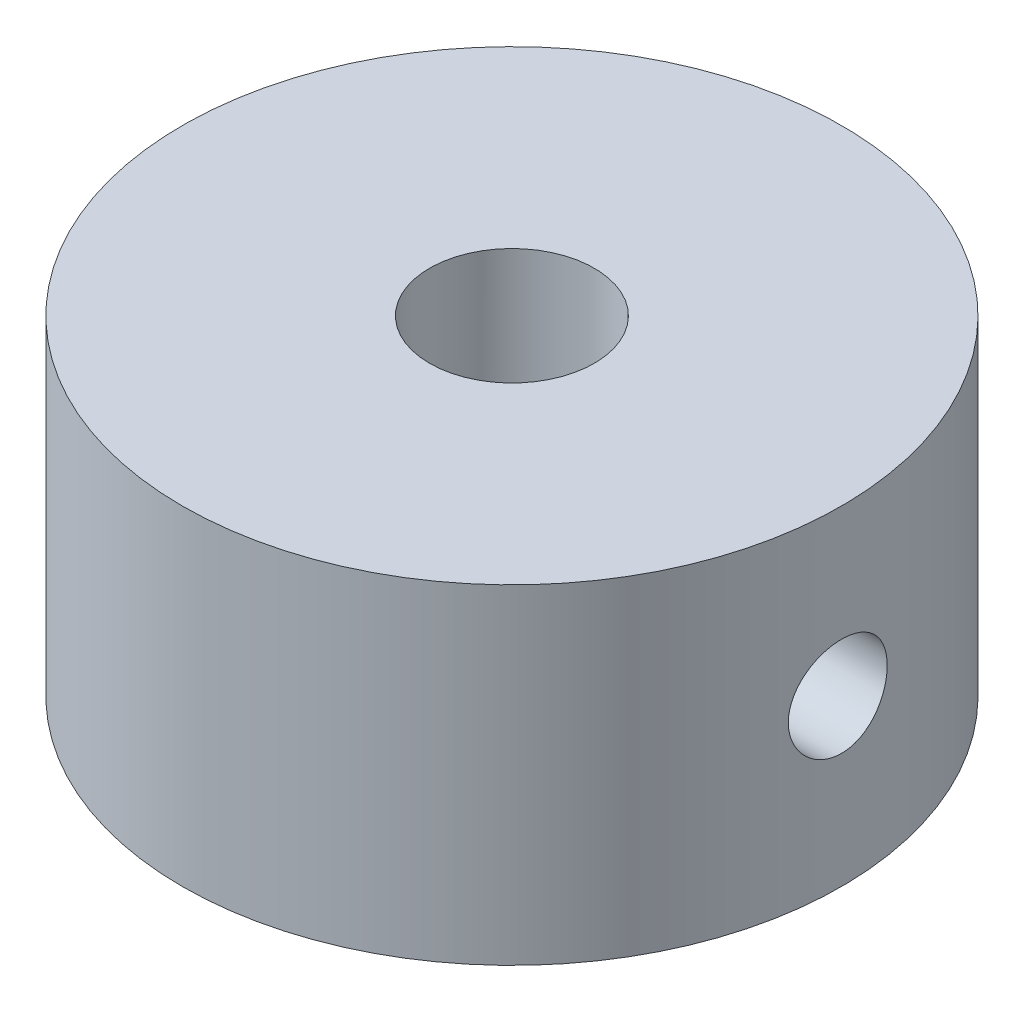
ISO-10303-21;
HEADER;
FILE_DESCRIPTION(('STEP AP214'),'2;1');
FILE_NAME('part.step','',(''),(''),'','','');
FILE_SCHEMA(('AUTOMOTIVE_DESIGN { 1 0 10303 214 1 1 1 1 }'));
ENDSEC;
DATA;
#1=APPLICATION_CONTEXT('core data for automotive mechanical design processes');
#2=APPLICATION_PROTOCOL_DEFINITION('international standard','automotive_design',2000,#1);
#3=PRODUCT_CONTEXT('',#1,'mechanical');
#4=PRODUCT('Part','Part','',(#3));
#5=PRODUCT_RELATED_PRODUCT_CATEGORY('part','',(#4));
#6=PRODUCT_DEFINITION_FORMATION('','',#4);
#7=PRODUCT_DEFINITION_CONTEXT('part definition',#1,'design');
#8=PRODUCT_DEFINITION('design','',#6,#7);
#9=PRODUCT_DEFINITION_SHAPE('','',#8);
#10=(LENGTH_UNIT() NAMED_UNIT(*) SI_UNIT(.MILLI.,.METRE.));
#11=(NAMED_UNIT(*) PLANE_ANGLE_UNIT() SI_UNIT($,.RADIAN.));
#12=(NAMED_UNIT(*) SI_UNIT($,.STERADIAN.) SOLID_ANGLE_UNIT());
#13=UNCERTAINTY_MEASURE_WITH_UNIT(LENGTH_MEASURE(1.E-05),#10,'distance_accuracy_value','');
#14=(GEOMETRIC_REPRESENTATION_CONTEXT(3) GLOBAL_UNCERTAINTY_ASSIGNED_CONTEXT((#13)) GLOBAL_UNIT_ASSIGNED_CONTEXT((#10,
#11,#12)) REPRESENTATION_CONTEXT('',''));
#15=CARTESIAN_POINT('',(0.,0.,0.));
#16=DIRECTION('',(0.,0.,1.));
#17=DIRECTION('',(1.,0.,0.));
#18=AXIS2_PLACEMENT_3D('',#15,#16,#17);
#19=CARTESIAN_POINT('',(0.,10.,0.));
#20=DIRECTION('',(0.,1.,0.));
#21=DIRECTION('',(0.,0.,1.));
#22=AXIS2_PLACEMENT_3D('',#19,#20,#21);
#23=PLANE('',#22);
#24=CARTESIAN_POINT('',(0.,10.,0.));
#25=DIRECTION('',(0.,1.,0.));
#26=DIRECTION('',(0.,0.,1.));
#27=AXIS2_PLACEMENT_3D('',#24,#25,#26);
#28=CIRCLE('',#27,10.);
#29=CARTESIAN_POINT('',(0.,10.,10.));
#30=VERTEX_POINT('',#29);
#31=EDGE_CURVE('E10',#30,#30,#28,.T.);
#32=ORIENTED_EDGE('',*,*,#31,.T.);
#33=EDGE_LOOP('',(#32));
#34=FACE_BOUND('',#33,.T.);
#35=CARTESIAN_POINT('',(0.,10.,0.));
#36=DIRECTION('',(0.,1.,0.));
#37=DIRECTION('',(0.,0.,1.));
#38=AXIS2_PLACEMENT_3D('',#35,#36,#37);
#39=CIRCLE('',#38,2.5);
#40=CARTESIAN_POINT('',(0.,10.,2.5));
#41=VERTEX_POINT('',#40);
#42=EDGE_CURVE('E49',#41,#41,#39,.T.);
#43=ORIENTED_EDGE('',*,*,#42,.F.);
#44=EDGE_LOOP('',(#43));
#45=FACE_BOUND('',#44,.T.);
#46=ADVANCED_FACE('F31',(#34,#45),#23,.T.);
#47=CARTESIAN_POINT('',(0.,0.,0.));
#48=DIRECTION('',(0.,1.,0.));
#49=DIRECTION('',(0.,0.,1.));
#50=AXIS2_PLACEMENT_3D('',#47,#48,#49);
#51=PLANE('',#50);
#52=CARTESIAN_POINT('',(0.,0.,0.));
#53=DIRECTION('',(0.,1.,0.));
#54=DIRECTION('',(0.,0.,1.));
#55=AXIS2_PLACEMENT_3D('',#52,#53,#54);
#56=CIRCLE('',#55,10.);
#57=CARTESIAN_POINT('',(0.,0.,10.));
#58=VERTEX_POINT('',#57);
#59=EDGE_CURVE('E44',#58,#58,#56,.T.);
#60=ORIENTED_EDGE('',*,*,#59,.F.);
#61=EDGE_LOOP('',(#60));
#62=FACE_BOUND('',#61,.T.);
#63=CARTESIAN_POINT('',(0.,0.,0.));
#64=DIRECTION('',(0.,1.,0.));
#65=DIRECTION('',(0.,0.,1.));
#66=AXIS2_PLACEMENT_3D('',#63,#64,#65);
#67=CIRCLE('',#66,2.5);
#68=CARTESIAN_POINT('',(0.,0.,2.5));
#69=VERTEX_POINT('',#68);
#70=EDGE_CURVE('E52',#69,#69,#67,.T.);
#71=ORIENTED_EDGE('',*,*,#70,.T.);
#72=EDGE_LOOP('',(#71));
#73=FACE_BOUND('',#72,.T.);
#74=ADVANCED_FACE('F85',(#62,#73),#51,.F.);
#75=CARTESIAN_POINT('',(0.,10.,0.));
#76=DIRECTION('',(0.,-1.,0.));
#77=DIRECTION('',(0.,0.,-1.));
#78=AXIS2_PLACEMENT_3D('',#75,#76,#77);
#79=CYLINDRICAL_SURFACE('',#78,10.);
#80=CARTESIAN_POINT('',(-9.88685996664259,5.,-1.5));
#81=CARTESIAN_POINT('',(-9.88686136668593,5.08374556928995,-1.49999654107284));
#82=CARTESIAN_POINT('',(-9.88793551739101,5.16753975075071,-1.49296296388491));
#83=CARTESIAN_POINT('',(-9.8921131480324,5.33278531488313,-1.46502196657001));
#84=CARTESIAN_POINT('',(-9.8952186073143,5.41423433148001,-1.44410101402628));
#85=CARTESIAN_POINT('',(-9.90309938986228,5.5723737554469,-1.38902526098084));
#86=CARTESIAN_POINT('',(-9.90787343131536,5.64906776254216,-1.35488061681397));
#87=CARTESIAN_POINT('',(-9.91855194113145,5.79562703077208,-1.27435063087791));
#88=CARTESIAN_POINT('',(-9.92445625383668,5.8654932302143,-1.22796697429872));
#89=CARTESIAN_POINT('',(-9.9367828924804,5.99698381675433,-1.12387902418558));
#90=CARTESIAN_POINT('',(-9.94320862458057,6.05854561340674,-1.0660960558482));
#91=CARTESIAN_POINT('',(-9.95582368169047,6.1711374856555,-0.941019605444373));
#92=CARTESIAN_POINT('',(-9.96201299368615,6.22216698216699,-0.873725600786529));
#93=CARTESIAN_POINT('',(-9.97349347428185,6.31247663169136,-0.731136358052745));
#94=CARTESIAN_POINT('',(-9.97878018435569,6.35169915032246,-0.655804227365766));
#95=CARTESIAN_POINT('',(-9.98782206746405,6.41691159880818,-0.499528850106974));
#96=CARTESIAN_POINT('',(-9.99157732141945,6.44290222784289,-0.418585900270677));
#97=CARTESIAN_POINT('',(-9.99710914797782,6.48072338853084,-0.254031123090569));
#98=CARTESIAN_POINT('',(-9.99890035887344,6.49265872638717,-0.170443884389866));
#99=CARTESIAN_POINT('',(-10.0003524476958,6.5023559348249,-0.0024352040194791));
#100=CARTESIAN_POINT('',(-10.0000134440494,6.50011859331969,0.0819861910157462));
#101=CARTESIAN_POINT('',(-9.99725499660796,6.48161666223757,0.24855171820052));
#102=CARTESIAN_POINT('',(-9.99485227652479,6.46546482820852,0.330708691400007));
#103=CARTESIAN_POINT('',(-9.98825500227851,6.41976939367743,0.491132829143137));
#104=CARTESIAN_POINT('',(-9.98406040199739,6.39022544849856,0.569399893513481));
#105=CARTESIAN_POINT('',(-9.97432193873206,6.31846900308291,0.720163780770317));
#106=CARTESIAN_POINT('',(-9.96877303515638,6.27620903489126,0.792637672323596));
#107=CARTESIAN_POINT('',(-9.95694438245421,6.18025480633001,0.929507907150177));
#108=CARTESIAN_POINT('',(-9.95066458523184,6.12655979329314,0.993903718271735));
#109=CARTESIAN_POINT('',(-9.93800158192627,6.00863155117341,1.11345448272265));
#110=CARTESIAN_POINT('',(-9.93161796623257,5.94429987802989,1.16851232950947));
#111=CARTESIAN_POINT('',(-9.91952704453523,5.80725892287627,1.26706599338813));
#112=CARTESIAN_POINT('',(-9.91381974269649,5.73454958928008,1.31056173927999));
#113=CARTESIAN_POINT('',(-9.90372775286855,5.58271603705936,1.38476964534605));
#114=CARTESIAN_POINT('',(-9.89934409845291,5.50358686633761,1.41547182270082));
#115=CARTESIAN_POINT('',(-9.89241402899059,5.34121474485261,1.46312336208879));
#116=CARTESIAN_POINT('',(-9.88986748446299,5.25797208445325,1.48007369337326));
#117=CARTESIAN_POINT('',(-9.88692451395027,5.09059991042251,1.49960720086655));
#118=CARTESIAN_POINT('',(-9.88650748802574,5.00648681179847,1.50232803265052));
#119=CARTESIAN_POINT('',(-9.88781607937153,4.83900580518266,1.49369057019819));
#120=CARTESIAN_POINT('',(-9.88954163015778,4.75563787414923,1.48233271282302));
#121=CARTESIAN_POINT('',(-9.89492202461453,4.59244018203437,1.44597702952766));
#122=CARTESIAN_POINT('',(-9.89856716482858,4.5125947950584,1.42104778527821));
#123=CARTESIAN_POINT('',(-9.90736801825768,4.35821590795139,1.35832831947087));
#124=CARTESIAN_POINT('',(-9.91252380607176,4.2836826703718,1.32053746276389));
#125=CARTESIAN_POINT('',(-9.92381355687063,4.14142673966496,1.23283677995324));
#126=CARTESIAN_POINT('',(-9.92995459279988,4.07375955272018,1.18283784561766));
#127=CARTESIAN_POINT('',(-9.94250159433355,3.94772714012619,1.07226416837201));
#128=CARTESIAN_POINT('',(-9.94890757490292,3.88936244081885,1.0116888274468));
#129=CARTESIAN_POINT('',(-9.96132705217386,3.78309739336642,0.881075619628184));
#130=CARTESIAN_POINT('',(-9.96733683460423,3.73528827175752,0.810963126771958));
#131=CARTESIAN_POINT('',(-9.97822905032016,3.65212709473736,0.663622080263682));
#132=CARTESIAN_POINT('',(-9.98311151444563,3.61677469853497,0.586393721360439));
#133=CARTESIAN_POINT('',(-9.99118269660795,3.55967625751197,0.427297995861147));
#134=CARTESIAN_POINT('',(-9.99437761717899,3.53788033292164,0.345448858754303));
#135=CARTESIAN_POINT('',(-9.99873976656896,3.50835212046253,0.179200815501194));
#136=CARTESIAN_POINT('',(-9.99990712930801,3.50061890375086,0.0948020781305815));
#137=CARTESIAN_POINT('',(-10.0000812905914,3.4994582954506,-0.073264590860818));
#138=CARTESIAN_POINT('',(-9.99910917023796,3.50589131912302,-0.156931570212052));
#139=CARTESIAN_POINT('',(-9.99515610519141,3.53258138842076,-0.321979795323107));
#140=CARTESIAN_POINT('',(-9.99217516692666,3.55283838980856,-0.403361048396512));
#141=CARTESIAN_POINT('',(-9.98453786742463,3.60655187557024,-0.561489374379661));
#142=CARTESIAN_POINT('',(-9.97988273316947,3.63999869513893,-0.638239793148783));
#143=CARTESIAN_POINT('',(-9.96940834495499,3.71912748798314,-0.785061117896603));
#144=CARTESIAN_POINT('',(-9.96358905320338,3.76480985848034,-0.855131806920709));
#145=CARTESIAN_POINT('',(-9.95136510636178,3.86761769882917,-0.987312585191959));
#146=CARTESIAN_POINT('',(-9.94495548425942,3.92484622581634,-1.04934206644638));
#147=CARTESIAN_POINT('',(-9.93231001689001,4.04890507308047,-1.16296808390268));
#148=CARTESIAN_POINT('',(-9.92607421276291,4.11573764382435,-1.21456216798984));
#149=CARTESIAN_POINT('',(-9.91444484029116,4.25754898323253,-1.30611310822974));
#150=CARTESIAN_POINT('',(-9.90905620156985,4.33257141702183,-1.34600294291209));
#151=CARTESIAN_POINT('',(-9.89978909110724,4.4882967767633,-1.41255613872045));
#152=CARTESIAN_POINT('',(-9.89590905307931,4.56899370785782,-1.43923322574898));
#153=CARTESIAN_POINT('',(-9.89099485524825,4.70837743625648,-1.47254951890026));
#154=CARTESIAN_POINT('',(-9.88945249382379,4.76620339692427,-1.4828276978042));
#155=CARTESIAN_POINT('',(-9.88738456567011,4.88267829173435,-1.49655410576574));
#156=CARTESIAN_POINT('',(-9.88685898576155,4.94132721519961,-1.50000242335076));
#157=CARTESIAN_POINT('',(-9.88685996664259,5.,-1.5));
#158=B_SPLINE_CURVE_WITH_KNOTS('',3,(#80,#81,#82,#83,#84,#85,#86,#87,#88,#89,#90,#91,#92,#93,
#94,#95,#96,#97,#98,#99,#100,#101,#102,#103,#104,#105,#106,#107,#108,#109,#110,#111,#112,#113,
#114,#115,#116,#117,#118,#119,#120,#121,#122,#123,#124,#125,#126,#127,#128,#129,#130,#131,#132,
#133,#134,#135,#136,#137,#138,#139,#140,#141,#142,#143,#144,#145,#146,#147,#148,#149,#150,#151,
#152,#153,#154,#155,#156,#157),.UNSPECIFIED.,.T.,.F.,(4,2,2,2,2,2,2,2,2,2,2,2,2,2,2,2,2,2,2,2,2,
2,2,2,2,2,2,2,2,2,2,2,2,2,2,2,2,2,4),(0.,0.251022251804869,0.502289469561802,0.753364085335675,
1.00440414866133,1.25724158649108,1.51009292207817,1.76415922105782,2.01821209364501,
2.27035832534397,2.52249053939374,2.77259862515728,3.02271314839401,3.27377316386454,
3.52484970949272,3.77839544666269,4.0319427451435,4.28568751773139,4.53941440444341,
4.79068214603744,5.04194209099918,5.29194394807374,5.54195815286117,5.79385486001302,
6.04576581461802,6.29977537753516,6.55377799071854,6.8068404089109,7.05988611170473,
7.31044963622327,7.56101235892823,7.81139182257833,8.06177941567107,8.31450950010969,
8.56729890236862,8.82150878824931,9.07545403445564,9.25132441891613,9.42719252376192),.UNSPECIFIED.);
#159=CARTESIAN_POINT('',(-9.88685996664259,5.,-1.5));
#160=VERTEX_POINT('',#159);
#161=EDGE_CURVE('E75',#160,#160,#158,.T.);
#162=ORIENTED_EDGE('',*,*,#161,.T.);
#163=EDGE_LOOP('',(#162));
#164=FACE_BOUND('',#163,.T.);
#165=CARTESIAN_POINT('',(9.88685996664259,5.,-1.5));
#166=CARTESIAN_POINT('',(9.88686136668593,4.91625443071005,-1.49999654107284));
#167=CARTESIAN_POINT('',(9.88793551739101,4.83246024924929,-1.49296296388491));
#168=CARTESIAN_POINT('',(9.8921131480324,4.66721468511687,-1.46502196657001));
#169=CARTESIAN_POINT('',(9.8952186073143,4.58576566851999,-1.44410101402628));
#170=CARTESIAN_POINT('',(9.90309938986228,4.4276262445531,-1.38902526098084));
#171=CARTESIAN_POINT('',(9.90787343131536,4.35093223745784,-1.35488061681397));
#172=CARTESIAN_POINT('',(9.91855194113145,4.20437296922792,-1.27435063087791));
#173=CARTESIAN_POINT('',(9.92445625383668,4.1345067697857,-1.22796697429872));
#174=CARTESIAN_POINT('',(9.9367828924804,4.00301618324567,-1.12387902418558));
#175=CARTESIAN_POINT('',(9.94320862458057,3.94145438659326,-1.0660960558482));
#176=CARTESIAN_POINT('',(9.95582368169047,3.8288625143445,-0.941019605444373));
#177=CARTESIAN_POINT('',(9.96201299368615,3.77783301783301,-0.873725600786529));
#178=CARTESIAN_POINT('',(9.97349347428185,3.68752336830864,-0.731136358052745));
#179=CARTESIAN_POINT('',(9.97878018435569,3.64830084967754,-0.655804227365766));
#180=CARTESIAN_POINT('',(9.98782206746405,3.58308840119182,-0.499528850106974));
#181=CARTESIAN_POINT('',(9.99157732141945,3.55709777215711,-0.418585900270677));
#182=CARTESIAN_POINT('',(9.99710914797782,3.51927661146916,-0.254031123090569));
#183=CARTESIAN_POINT('',(9.99890035887344,3.50734127361284,-0.170443884389866));
#184=CARTESIAN_POINT('',(10.0003524476958,3.4976440651751,-0.00243520401947892));
#185=CARTESIAN_POINT('',(10.0000134440494,3.49988140668031,0.0819861910157463));
#186=CARTESIAN_POINT('',(9.99725499660796,3.51838333776243,0.24855171820052));
#187=CARTESIAN_POINT('',(9.99485227652479,3.53453517179148,0.330708691400008));
#188=CARTESIAN_POINT('',(9.98825500227851,3.58023060632258,0.491132829143137));
#189=CARTESIAN_POINT('',(9.98406040199739,3.60977455150144,0.569399893513482));
#190=CARTESIAN_POINT('',(9.97432193873206,3.68153099691709,0.720163780770317));
#191=CARTESIAN_POINT('',(9.96877303515638,3.72379096510874,0.792637672323596));
#192=CARTESIAN_POINT('',(9.95694438245421,3.81974519366999,0.929507907150178));
#193=CARTESIAN_POINT('',(9.95066458523184,3.87344020670687,0.993903718271736));
#194=CARTESIAN_POINT('',(9.93800158192627,3.99136844882659,1.11345448272265));
#195=CARTESIAN_POINT('',(9.93161796623257,4.05570012197011,1.16851232950947));
#196=CARTESIAN_POINT('',(9.91952704453523,4.19274107712373,1.26706599338813));
#197=CARTESIAN_POINT('',(9.91381974269649,4.26545041071992,1.31056173927999));
#198=CARTESIAN_POINT('',(9.90372775286855,4.41728396294064,1.38476964534605));
#199=CARTESIAN_POINT('',(9.89934409845291,4.49641313366239,1.41547182270082));
#200=CARTESIAN_POINT('',(9.89241402899059,4.65878525514739,1.46312336208879));
#201=CARTESIAN_POINT('',(9.88986748446299,4.74202791554675,1.48007369337326));
#202=CARTESIAN_POINT('',(9.88692451395027,4.90940008957749,1.49960720086655));
#203=CARTESIAN_POINT('',(9.88650748802574,4.99351318820153,1.50232803265052));
#204=CARTESIAN_POINT('',(9.88781607937153,5.16099419481734,1.49369057019819));
#205=CARTESIAN_POINT('',(9.88954163015778,5.24436212585076,1.48233271282302));
#206=CARTESIAN_POINT('',(9.89492202461453,5.40755981796563,1.44597702952766));
#207=CARTESIAN_POINT('',(9.89856716482858,5.4874052049416,1.42104778527821));
#208=CARTESIAN_POINT('',(9.90736801825768,5.64178409204861,1.35832831947087));
#209=CARTESIAN_POINT('',(9.91252380607176,5.7163173296282,1.32053746276389));
#210=CARTESIAN_POINT('',(9.92381355687063,5.85857326033504,1.23283677995324));
#211=CARTESIAN_POINT('',(9.92995459279988,5.92624044727982,1.18283784561766));
#212=CARTESIAN_POINT('',(9.94250159433355,6.05227285987381,1.07226416837201));
#213=CARTESIAN_POINT('',(9.94890757490292,6.11063755918115,1.0116888274468));
#214=CARTESIAN_POINT('',(9.96132705217386,6.21690260663358,0.881075619628183));
#215=CARTESIAN_POINT('',(9.96733683460423,6.26471172824248,0.810963126771957));
#216=CARTESIAN_POINT('',(9.97822905032016,6.34787290526264,0.663622080263681));
#217=CARTESIAN_POINT('',(9.98311151444563,6.38322530146503,0.586393721360439));
#218=CARTESIAN_POINT('',(9.99118269660795,6.44032374248803,0.427297995861147));
#219=CARTESIAN_POINT('',(9.99437761717899,6.46211966707836,0.345448858754303));
#220=CARTESIAN_POINT('',(9.99873976656896,6.49164787953747,0.179200815501194));
#221=CARTESIAN_POINT('',(9.99990712930801,6.49938109624914,0.0948020781305813));
#222=CARTESIAN_POINT('',(10.0000812905914,6.5005417045494,-0.0732645908608179));
#223=CARTESIAN_POINT('',(9.99910917023796,6.49410868087698,-0.156931570212051));
#224=CARTESIAN_POINT('',(9.99515610519141,6.46741861157924,-0.321979795323106));
#225=CARTESIAN_POINT('',(9.99217516692666,6.44716161019144,-0.403361048396512));
#226=CARTESIAN_POINT('',(9.98453786742463,6.39344812442976,-0.56148937437966));
#227=CARTESIAN_POINT('',(9.97988273316947,6.36000130486107,-0.638239793148782));
#228=CARTESIAN_POINT('',(9.96940834495499,6.28087251201686,-0.785061117896602));
#229=CARTESIAN_POINT('',(9.96358905320338,6.23519014151966,-0.855131806920708));
#230=CARTESIAN_POINT('',(9.95136510636178,6.13238230117083,-0.987312585191958));
#231=CARTESIAN_POINT('',(9.94495548425942,6.07515377418366,-1.04934206644638));
#232=CARTESIAN_POINT('',(9.93231001689001,5.95109492691953,-1.16296808390268));
#233=CARTESIAN_POINT('',(9.92607421276291,5.88426235617565,-1.21456216798984));
#234=CARTESIAN_POINT('',(9.91444484029116,5.74245101676747,-1.30611310822974));
#235=CARTESIAN_POINT('',(9.90905620156985,5.66742858297817,-1.34600294291209));
#236=CARTESIAN_POINT('',(9.89978909110724,5.5117032232367,-1.41255613872045));
#237=CARTESIAN_POINT('',(9.89590905307931,5.43100629214218,-1.43923322574897));
#238=CARTESIAN_POINT('',(9.89099485524825,5.29162256374353,-1.47254951890026));
#239=CARTESIAN_POINT('',(9.88945249382379,5.23379660307573,-1.4828276978042));
#240=CARTESIAN_POINT('',(9.88738456567011,5.11732170826565,-1.49655410576574));
#241=CARTESIAN_POINT('',(9.88685898576155,5.05867278480039,-1.50000242335076));
#242=CARTESIAN_POINT('',(9.88685996664259,5.,-1.5));
#243=B_SPLINE_CURVE_WITH_KNOTS('',3,(#165,#166,#167,#168,#169,#170,#171,#172,#173,#174,#175,
#176,#177,#178,#179,#180,#181,#182,#183,#184,#185,#186,#187,#188,#189,#190,#191,#192,#193,#194,
#195,#196,#197,#198,#199,#200,#201,#202,#203,#204,#205,#206,#207,#208,#209,#210,#211,#212,#213,
#214,#215,#216,#217,#218,#219,#220,#221,#222,#223,#224,#225,#226,#227,#228,#229,#230,#231,#232,
#233,#234,#235,#236,#237,#238,#239,#240,#241,#242),.UNSPECIFIED.,.T.,.F.,(4,2,2,2,2,2,2,2,2,2,2,
2,2,2,2,2,2,2,2,2,2,2,2,2,2,2,2,2,2,2,2,2,2,2,2,2,2,2,4),(0.,0.251022251804869,
0.502289469561802,0.753364085335675,1.00440414866133,1.25724158649108,1.51009292207817,
1.76415922105782,2.01821209364501,2.27035832534397,2.52249053939374,2.77259862515728,
3.02271314839401,3.27377316386454,3.52484970949272,3.77839544666269,4.0319427451435,
4.28568751773139,4.53941440444341,4.79068214603744,5.04194209099918,5.29194394807374,
5.54195815286117,5.79385486001302,6.04576581461802,6.29977537753516,6.55377799071854,
6.8068404089109,7.05988611170473,7.31044963622326,7.56101235892823,7.81139182257833,
8.06177941567106,8.31450950010969,8.56729890236862,8.82150878824931,9.07545403445563,
9.25132441891613,9.42719252376192),.UNSPECIFIED.);
#244=CARTESIAN_POINT('',(9.88685996664259,5.,-1.5));
#245=VERTEX_POINT('',#244);
#246=EDGE_CURVE('E71',#245,#245,#243,.T.);
#247=ORIENTED_EDGE('',*,*,#246,.T.);
#248=EDGE_LOOP('',(#247));
#249=FACE_BOUND('',#248,.T.);
#250=ORIENTED_EDGE('',*,*,#31,.F.);
#251=EDGE_LOOP('',(#250));
#252=FACE_BOUND('',#251,.T.);
#253=ORIENTED_EDGE('',*,*,#59,.T.);
#254=EDGE_LOOP('',(#253));
#255=FACE_BOUND('',#254,.T.);
#256=ADVANCED_FACE('F33',(#164,#249,#252,#255),#79,.T.);
#257=CARTESIAN_POINT('',(0.,10.,0.));
#258=DIRECTION('',(0.,-1.,0.));
#259=DIRECTION('',(0.,0.,-1.));
#260=AXIS2_PLACEMENT_3D('',#257,#258,#259);
#261=CYLINDRICAL_SURFACE('',#260,2.5);
#262=CARTESIAN_POINT('',(-2.,5.,-1.5));
#263=CARTESIAN_POINT('',(-1.99999416642511,5.07547897528964,-1.50000404108592));
#264=CARTESIAN_POINT('',(-2.00433633903481,5.1509384340798,-1.49426852824014));
#265=CARTESIAN_POINT('',(-2.02092590613883,5.29932390396222,-1.47174965152787));
#266=CARTESIAN_POINT('',(-2.03318155043097,5.3722471873851,-1.45495475788936));
#267=CARTESIAN_POINT('',(-2.0636233903473,5.51308364167728,-1.41143486335795));
#268=CARTESIAN_POINT('',(-2.08176666183119,5.58102883803527,-1.3847815450315));
#269=CARTESIAN_POINT('',(-2.12185904995835,5.71143745336792,-1.3225290928302));
#270=CARTESIAN_POINT('',(-2.14380930122415,5.77389922969514,-1.28692729054693));
#271=CARTESIAN_POINT('',(-2.19228594587542,5.89994901666408,-1.20271292747644));
#272=CARTESIAN_POINT('',(-2.21904371037662,5.96274095712394,-1.15304179435289));
#273=CARTESIAN_POINT('',(-2.2722622943106,6.07976476274175,-1.04426801309985));
#274=CARTESIAN_POINT('',(-2.29872287517103,6.1339901516708,-0.985158296729613));
#275=CARTESIAN_POINT('',(-2.35175567858734,6.2381338097097,-0.851442367411702));
#276=CARTESIAN_POINT('',(-2.37803133577818,6.28695446366975,-0.775851995162548));
#277=CARTESIAN_POINT('',(-2.42443786983179,6.37080972244443,-0.615654228271659));
#278=CARTESIAN_POINT('',(-2.44457437988735,6.40585697412271,-0.531055196626331));
#279=CARTESIAN_POINT('',(-2.4747098780044,6.45759592281265,-0.363771406742667));
#280=CARTESIAN_POINT('',(-2.4854930393917,6.4757203609673,-0.281674698130916));
#281=CARTESIAN_POINT('',(-2.49874939277545,6.49794280286312,-0.114970509382709));
#282=CARTESIAN_POINT('',(-2.50123038813307,6.50205397800006,-0.030365462400154));
#283=CARTESIAN_POINT('',(-2.49783372711539,6.49638625265754,0.127637283737309));
#284=CARTESIAN_POINT('',(-2.49295437513726,6.48826647383069,0.201123832865634));
#285=CARTESIAN_POINT('',(-2.47707997553857,6.46152020435189,0.345464269151767));
#286=CARTESIAN_POINT('',(-2.46608447529309,6.44289293609285,0.416317961051201));
#287=CARTESIAN_POINT('',(-2.43884907201719,6.39583443729622,0.554056780469079));
#288=CARTESIAN_POINT('',(-2.42257910450824,6.367346938861,0.620916491037617));
#289=CARTESIAN_POINT('',(-2.38609637638748,6.30161538377446,0.74898866011561));
#290=CARTESIAN_POINT('',(-2.36588259201812,6.26436905294099,0.81019964620801));
#291=CARTESIAN_POINT('',(-2.32037925976362,6.17716090719555,0.933074267143199));
#292=CARTESIAN_POINT('',(-2.2947718295215,6.12621168826427,0.993918663198192));
#293=CARTESIAN_POINT('',(-2.24255554245601,6.01559588213983,1.10671465909274));
#294=CARTESIAN_POINT('',(-2.21594536703375,5.95591749652549,1.1586540130834));
#295=CARTESIAN_POINT('',(-2.16111075123946,5.82134659383645,1.25824837767417));
#296=CARTESIAN_POINT('',(-2.13305661385124,5.74549242346054,1.30470933188632));
#297=CARTESIAN_POINT('',(-2.08250879557267,5.58529376836339,1.38397217194232));
#298=CARTESIAN_POINT('',(-2.0600049029882,5.50096528387436,1.41679921962189));
#299=CARTESIAN_POINT('',(-2.02895865196731,5.34760636810465,1.46077497064842));
#300=CARTESIAN_POINT('',(-2.01833888618315,5.27995936770336,1.47527903312665));
#301=CARTESIAN_POINT('',(-2.00392150777558,5.14262638970052,1.49480872755284));
#302=CARTESIAN_POINT('',(-2.00011596115116,5.07294287951544,1.49984538302907));
#303=CARTESIAN_POINT('',(-1.99988914321323,4.93344831756429,1.50014781114183));
#304=CARTESIAN_POINT('',(-2.00347810223984,4.86363722278479,1.49540004697659));
#305=CARTESIAN_POINT('',(-2.01751520788652,4.72601265625144,1.47640290574941));
#306=CARTESIAN_POINT('',(-2.02796877613213,4.65820080775975,1.46214601830139));
#307=CARTESIAN_POINT('',(-2.054317683331,4.52628542052021,1.42488312618657));
#308=CARTESIAN_POINT('',(-2.07020622092812,4.46217736346777,1.40188805257362));
#309=CARTESIAN_POINT('',(-2.10571539417587,4.33852228426982,1.34796261057072));
#310=CARTESIAN_POINT('',(-2.12533743689999,4.278976993634,1.31702924888212));
#311=CARTESIAN_POINT('',(-2.17036819177736,4.15475991748775,1.24167439558512));
#312=CARTESIAN_POINT('',(-2.19618239397369,4.09109916490343,1.19582663060303));
#313=CARTESIAN_POINT('',(-2.2482175480362,3.97171451515054,1.09487395518701));
#314=CARTESIAN_POINT('',(-2.27443886711455,3.91599830783088,1.03976018672402));
#315=CARTESIAN_POINT('',(-2.32835625910913,3.80677599264957,0.913274837212767));
#316=CARTESIAN_POINT('',(-2.3558007587587,3.75449927339416,0.840721108780192));
#317=CARTESIAN_POINT('',(-2.40537639133459,3.66309722316335,0.686103100868021));
#318=CARTESIAN_POINT('',(-2.4275110444941,3.62396317215908,0.604045176134703));
#319=CARTESIAN_POINT('',(-2.46252280092775,3.56313179656863,0.438840232972139));
#320=CARTESIAN_POINT('',(-2.47595588067329,3.54037377220889,0.356205963651259));
#321=CARTESIAN_POINT('',(-2.494407389061,3.50928539715374,0.187383063890858));
#322=CARTESIAN_POINT('',(-2.49943534582737,3.50093870928238,0.101198571781969));
#323=CARTESIAN_POINT('',(-2.50040600461976,3.49932539141407,-0.0598120232009833));
#324=CARTESIAN_POINT('',(-2.49747057186327,3.50419666543697,-0.134620583589705));
#325=CARTESIAN_POINT('',(-2.48512948412095,3.52489382438162,-0.282148755978773));
#326=CARTESIAN_POINT('',(-2.47572375706639,3.5407198313216,-0.354868344701913));
#327=CARTESIAN_POINT('',(-2.45149427526962,3.58221957158379,-0.495145481978796));
#328=CARTESIAN_POINT('',(-2.43675966858906,3.60773159612924,-0.56276703260883));
#329=CARTESIAN_POINT('',(-2.40303337447155,3.66764059455475,-0.692781971999984));
#330=CARTESIAN_POINT('',(-2.38404073252268,3.7020395608596,-0.755174184199832));
#331=CARTESIAN_POINT('',(-2.3409343265938,3.78292519656876,-0.880263645295947));
#332=CARTESIAN_POINT('',(-2.31648844639149,3.83031870901687,-0.94225869043994));
#333=CARTESIAN_POINT('',(-2.26601907350661,3.93375303371772,-1.05789751536307));
#334=CARTESIAN_POINT('',(-2.23999385274509,3.98980342560791,-1.11153190956916));
#335=CARTESIAN_POINT('',(-2.18528165666204,4.1172855621777,-1.2159097535057));
#336=CARTESIAN_POINT('',(-2.15667566270901,4.1897664861655,-1.26542406663367));
#337=CARTESIAN_POINT('',(-2.10376464485145,4.34348485276654,-1.35156817210325));
#338=CARTESIAN_POINT('',(-2.07945738811052,4.42471771398141,-1.38820466322661));
#339=CARTESIAN_POINT('',(-2.0408000304796,4.5870642851372,-1.44437116535132));
#340=CARTESIAN_POINT('',(-2.02577665830138,4.66759523596125,-1.46509526060187));
#341=CARTESIAN_POINT('',(-2.00539032320036,4.83209739470368,-1.49289268240426));
#342=CARTESIAN_POINT('',(-2.00000648744643,4.91606076575871,-1.49999550595837));
#343=CARTESIAN_POINT('',(-2.,5.,-1.5));
#344=B_SPLINE_CURVE_WITH_KNOTS('',3,(#262,#263,#264,#265,#266,#267,#268,#269,#270,#271,#272,
#273,#274,#275,#276,#277,#278,#279,#280,#281,#282,#283,#284,#285,#286,#287,#288,#289,#290,#291,
#292,#293,#294,#295,#296,#297,#298,#299,#300,#301,#302,#303,#304,#305,#306,#307,#308,#309,#310,
#311,#312,#313,#314,#315,#316,#317,#318,#319,#320,#321,#322,#323,#324,#325,#326,#327,#328,#329,
#330,#331,#332,#333,#334,#335,#336,#337,#338,#339,#340,#341,#342,#343),.UNSPECIFIED.,.T.,.F.,(4,
2,2,2,2,2,2,2,2,2,2,2,2,2,2,2,2,2,2,2,2,2,2,2,2,2,2,2,2,2,2,2,2,2,2,2,2,2,2,2,4),(0.,
0.226085249493392,0.45240657433077,0.677113624991873,0.901887762215932,1.15414462390001,
1.40659128601844,1.68630157736223,1.9657544327122,2.21853330858497,2.47107452602766,
2.69230130543181,2.91354445887944,3.13607155036376,3.35865648368878,3.60782810055849,
3.85733966656908,4.13576671140276,4.41367760154768,4.62276298054684,4.83160475643976,
5.04073566011181,5.25003193304128,5.45906724365495,5.66818149154661,5.91499438482002,
6.16204457978454,6.44121828011588,6.72020638384847,6.97891479383337,7.23732973022726,
7.46129321849399,7.68525920139648,7.90563970188756,8.12606965394584,8.37042963549487,
8.61506198741955,8.89071695766604,9.16622832484805,9.41820120134354,9.66962780912277),.UNSPECIFIED.);
#345=CARTESIAN_POINT('',(-2.,5.,-1.5));
#346=VERTEX_POINT('',#345);
#347=EDGE_CURVE('E36',#346,#346,#344,.T.);
#348=ORIENTED_EDGE('',*,*,#347,.F.);
#349=EDGE_LOOP('',(#348));
#350=FACE_BOUND('',#349,.T.);
#351=CARTESIAN_POINT('',(2.,5.,-1.5));
#352=CARTESIAN_POINT('',(1.99999416642511,4.92452102471036,-1.50000404108592));
#353=CARTESIAN_POINT('',(2.00433633903481,4.8490615659202,-1.49426852824014));
#354=CARTESIAN_POINT('',(2.02092590613883,4.70067609603778,-1.47174965152787));
#355=CARTESIAN_POINT('',(2.03318155043097,4.6277528126149,-1.45495475788936));
#356=CARTESIAN_POINT('',(2.0636233903473,4.48691635832272,-1.41143486335795));
#357=CARTESIAN_POINT('',(2.08176666183119,4.41897116196473,-1.3847815450315));
#358=CARTESIAN_POINT('',(2.12185904995836,4.28856254663208,-1.32252909283019));
#359=CARTESIAN_POINT('',(2.14380930122415,4.22610077030486,-1.28692729054693));
#360=CARTESIAN_POINT('',(2.19228594587542,4.10005098333592,-1.20271292747644));
#361=CARTESIAN_POINT('',(2.21904371037662,4.03725904287606,-1.15304179435289));
#362=CARTESIAN_POINT('',(2.2722622943106,3.92023523725825,-1.04426801309985));
#363=CARTESIAN_POINT('',(2.29872287517103,3.8660098483292,-0.985158296729613));
#364=CARTESIAN_POINT('',(2.35175567858734,3.7618661902903,-0.851442367411702));
#365=CARTESIAN_POINT('',(2.37803133577818,3.71304553633025,-0.775851995162548));
#366=CARTESIAN_POINT('',(2.42443786983179,3.62919027755557,-0.615654228271659));
#367=CARTESIAN_POINT('',(2.44457437988735,3.59414302587729,-0.531055196626331));
#368=CARTESIAN_POINT('',(2.4747098780044,3.54240407718735,-0.363771406742667));
#369=CARTESIAN_POINT('',(2.4854930393917,3.5242796390327,-0.281674698130915));
#370=CARTESIAN_POINT('',(2.49874939277545,3.50205719713688,-0.114970509382708));
#371=CARTESIAN_POINT('',(2.50123038813307,3.49794602199995,-0.0303654624001536));
#372=CARTESIAN_POINT('',(2.49783372711539,3.50361374734246,0.12763728373731));
#373=CARTESIAN_POINT('',(2.49295437513726,3.51173352616931,0.201123832865635));
#374=CARTESIAN_POINT('',(2.47707997553857,3.53847979564811,0.345464269151768));
#375=CARTESIAN_POINT('',(2.46608447529309,3.55710706390715,0.416317961051201));
#376=CARTESIAN_POINT('',(2.43884907201719,3.60416556270378,0.554056780469079));
#377=CARTESIAN_POINT('',(2.42257910450824,3.632653061139,0.620916491037617));
#378=CARTESIAN_POINT('',(2.38609637638748,3.69838461622554,0.748988660115611));
#379=CARTESIAN_POINT('',(2.36588259201812,3.73563094705901,0.810199646208011));
#380=CARTESIAN_POINT('',(2.32037925976362,3.82283909280445,0.9330742671432));
#381=CARTESIAN_POINT('',(2.2947718295215,3.87378831173574,0.993918663198193));
#382=CARTESIAN_POINT('',(2.24255554245601,3.98440411786018,1.10671465909275));
#383=CARTESIAN_POINT('',(2.21594536703375,4.04408250347451,1.1586540130834));
#384=CARTESIAN_POINT('',(2.16111075123945,4.17865340616355,1.25824837767417));
#385=CARTESIAN_POINT('',(2.13305661385124,4.25450757653946,1.30470933188632));
#386=CARTESIAN_POINT('',(2.08250879557267,4.41470623163661,1.38397217194232));
#387=CARTESIAN_POINT('',(2.0600049029882,4.49903471612564,1.41679921962189));
#388=CARTESIAN_POINT('',(2.02895865196731,4.65239363189535,1.46077497064842));
#389=CARTESIAN_POINT('',(2.01833888618315,4.72004063229664,1.47527903312665));
#390=CARTESIAN_POINT('',(2.00392150777558,4.85737361029948,1.49480872755284));
#391=CARTESIAN_POINT('',(2.00011596115116,4.92705712048456,1.49984538302907));
#392=CARTESIAN_POINT('',(1.99988914321323,5.06655168243571,1.50014781114183));
#393=CARTESIAN_POINT('',(2.00347810223984,5.13636277721521,1.49540004697659));
#394=CARTESIAN_POINT('',(2.01751520788652,5.27398734374856,1.47640290574941));
#395=CARTESIAN_POINT('',(2.02796877613213,5.34179919224025,1.46214601830139));
#396=CARTESIAN_POINT('',(2.054317683331,5.47371457947978,1.42488312618657));
#397=CARTESIAN_POINT('',(2.07020622092812,5.53782263653223,1.40188805257362));
#398=CARTESIAN_POINT('',(2.10571539417587,5.66147771573018,1.34796261057072));
#399=CARTESIAN_POINT('',(2.12533743689999,5.721023006366,1.31702924888212));
#400=CARTESIAN_POINT('',(2.17036819177736,5.84524008251224,1.24167439558512));
#401=CARTESIAN_POINT('',(2.19618239397369,5.90890083509657,1.19582663060303));
#402=CARTESIAN_POINT('',(2.2482175480362,6.02828548484946,1.09487395518701));
#403=CARTESIAN_POINT('',(2.27443886711455,6.08400169216911,1.03976018672402));
#404=CARTESIAN_POINT('',(2.32835625910913,6.19322400735043,0.913274837212769));
#405=CARTESIAN_POINT('',(2.3558007587587,6.24550072660584,0.840721108780194));
#406=CARTESIAN_POINT('',(2.40537639133458,6.33690277683665,0.686103100868023));
#407=CARTESIAN_POINT('',(2.4275110444941,6.37603682784092,0.604045176134705));
#408=CARTESIAN_POINT('',(2.46252280092775,6.43686820343137,0.43884023297214));
#409=CARTESIAN_POINT('',(2.47595588067329,6.45962622779111,0.35620596365126));
#410=CARTESIAN_POINT('',(2.494407389061,6.49071460284626,0.187383063890859));
#411=CARTESIAN_POINT('',(2.49943534582737,6.49906129071762,0.101198571781971));
#412=CARTESIAN_POINT('',(2.50040600461976,6.50067460858593,-0.0598120232009821));
#413=CARTESIAN_POINT('',(2.49747057186327,6.49580333456303,-0.134620583589704));
#414=CARTESIAN_POINT('',(2.48512948412095,6.47510617561839,-0.282148755978772));
#415=CARTESIAN_POINT('',(2.47572375706639,6.4592801686784,-0.354868344701912));
#416=CARTESIAN_POINT('',(2.45149427526962,6.41778042841621,-0.495145481978795));
#417=CARTESIAN_POINT('',(2.43675966858906,6.39226840387076,-0.562767032608829));
#418=CARTESIAN_POINT('',(2.40303337447155,6.33235940544525,-0.692781971999983));
#419=CARTESIAN_POINT('',(2.38404073252268,6.2979604391404,-0.755174184199831));
#420=CARTESIAN_POINT('',(2.3409343265938,6.21707480343124,-0.880263645295946));
#421=CARTESIAN_POINT('',(2.31648844639149,6.16968129098314,-0.942258690439939));
#422=CARTESIAN_POINT('',(2.26601907350661,6.06624696628228,-1.05789751536306));
#423=CARTESIAN_POINT('',(2.23999385274509,6.01019657439209,-1.11153190956916));
#424=CARTESIAN_POINT('',(2.18528165666204,5.8827144378223,-1.2159097535057));
#425=CARTESIAN_POINT('',(2.15667566270901,5.8102335138345,-1.26542406663367));
#426=CARTESIAN_POINT('',(2.10376464485145,5.65651514723346,-1.35156817210325));
#427=CARTESIAN_POINT('',(2.07945738811052,5.57528228601859,-1.38820466322661));
#428=CARTESIAN_POINT('',(2.0408000304796,5.4129357148628,-1.44437116535132));
#429=CARTESIAN_POINT('',(2.02577665830138,5.33240476403876,-1.46509526060187));
#430=CARTESIAN_POINT('',(2.00539032320036,5.16790260529632,-1.49289268240426));
#431=CARTESIAN_POINT('',(2.00000648744643,5.08393923424129,-1.49999550595837));
#432=CARTESIAN_POINT('',(2.,5.,-1.5));
#433=B_SPLINE_CURVE_WITH_KNOTS('',3,(#351,#352,#353,#354,#355,#356,#357,#358,#359,#360,#361,
#362,#363,#364,#365,#366,#367,#368,#369,#370,#371,#372,#373,#374,#375,#376,#377,#378,#379,#380,
#381,#382,#383,#384,#385,#386,#387,#388,#389,#390,#391,#392,#393,#394,#395,#396,#397,#398,#399,
#400,#401,#402,#403,#404,#405,#406,#407,#408,#409,#410,#411,#412,#413,#414,#415,#416,#417,#418,
#419,#420,#421,#422,#423,#424,#425,#426,#427,#428,#429,#430,#431,#432),.UNSPECIFIED.,.T.,.F.,(4,
2,2,2,2,2,2,2,2,2,2,2,2,2,2,2,2,2,2,2,2,2,2,2,2,2,2,2,2,2,2,2,2,2,2,2,2,2,2,2,4),(0.,
0.226085249493392,0.45240657433077,0.677113624991876,0.901887762215932,1.15414462390001,
1.40659128601844,1.68630157736223,1.9657544327122,2.21853330858497,2.47107452602766,
2.69230130543182,2.91354445887944,3.13607155036377,3.35865648368878,3.60782810055849,
3.85733966656908,4.13576671140276,4.41367760154768,4.62276298054684,4.83160475643976,
5.04073566011181,5.25003193304128,5.45906724365495,5.66818149154661,5.91499438482002,
6.16204457978454,6.44121828011588,6.72020638384847,6.97891479383337,7.23732973022726,
7.46129321849399,7.68525920139648,7.90563970188756,8.12606965394584,8.37042963549487,
8.61506198741954,8.89071695766603,9.16622832484805,9.41820120134354,9.66962780912277),.UNSPECIFIED.);
#434=CARTESIAN_POINT('',(2.,5.,-1.5));
#435=VERTEX_POINT('',#434);
#436=EDGE_CURVE('E54',#435,#435,#433,.T.);
#437=ORIENTED_EDGE('',*,*,#436,.F.);
#438=EDGE_LOOP('',(#437));
#439=FACE_BOUND('',#438,.T.);
#440=ORIENTED_EDGE('',*,*,#42,.T.);
#441=EDGE_LOOP('',(#440));
#442=FACE_BOUND('',#441,.T.);
#443=ORIENTED_EDGE('',*,*,#70,.F.);
#444=EDGE_LOOP('',(#443));
#445=FACE_BOUND('',#444,.T.);
#446=ADVANCED_FACE('F58',(#350,#439,#442,#445),#261,.F.);
#447=CARTESIAN_POINT('',(-18.,5.,0.));
#448=DIRECTION('',(1.,0.,0.));
#449=DIRECTION('',(0.,0.,-1.));
#450=AXIS2_PLACEMENT_3D('',#447,#448,#449);
#451=CYLINDRICAL_SURFACE('',#450,1.5);
#452=ORIENTED_EDGE('',*,*,#436,.T.);
#453=EDGE_LOOP('',(#452));
#454=FACE_BOUND('',#453,.T.);
#455=ORIENTED_EDGE('',*,*,#246,.F.);
#456=EDGE_LOOP('',(#455));
#457=FACE_BOUND('',#456,.T.);
#458=ADVANCED_FACE('F64',(#454,#457),#451,.F.);
#459=ORIENTED_EDGE('',*,*,#347,.T.);
#460=EDGE_LOOP('',(#459));
#461=FACE_BOUND('',#460,.T.);
#462=ORIENTED_EDGE('',*,*,#161,.F.);
#463=EDGE_LOOP('',(#462));
#464=FACE_BOUND('',#463,.T.);
#465=ADVANCED_FACE('F61',(#461,#464),#451,.F.);
#466=CLOSED_SHELL('',(#46,#74,#256,#446,#458,#465));
#467=MANIFOLD_SOLID_BREP('B2',#466);
#468=ADVANCED_BREP_SHAPE_REPRESENTATION('',(#18,#467),#14);
#469=SHAPE_DEFINITION_REPRESENTATION(#9,#468);
ENDSEC;
END-ISO-10303-21;
